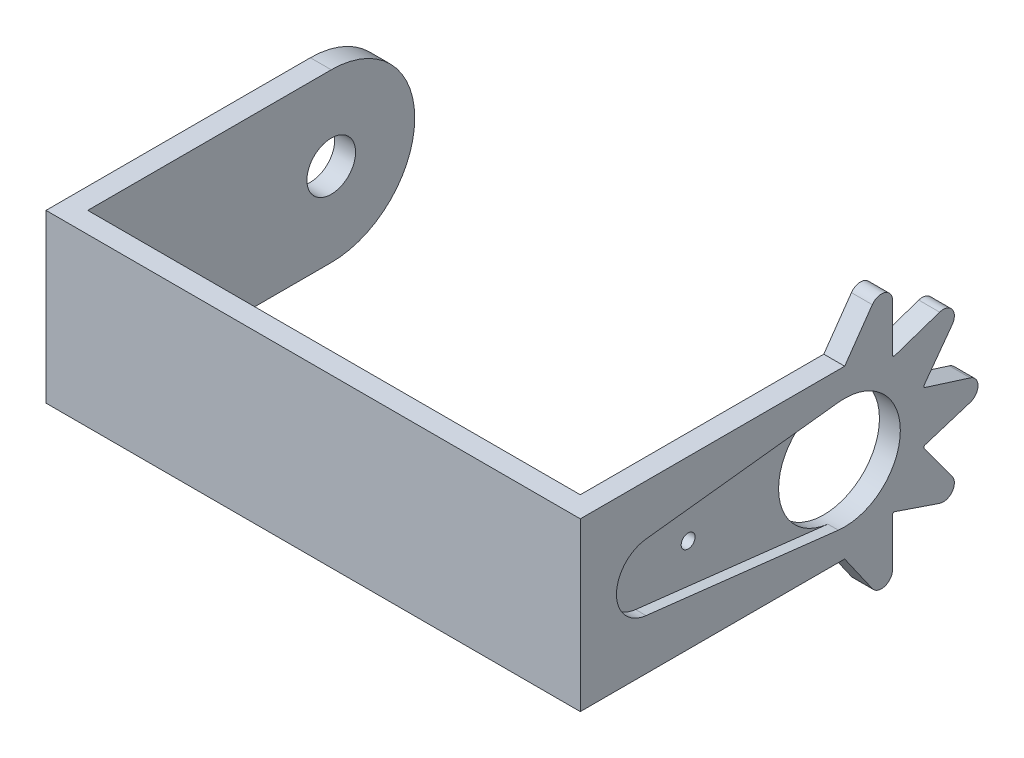
ISO-10303-21;
HEADER;
FILE_DESCRIPTION(('STEP AP214'),'2;1');
FILE_NAME('part.step','',(''),(''),'','','');
FILE_SCHEMA(('AUTOMOTIVE_DESIGN { 1 0 10303 214 1 1 1 1 }'));
ENDSEC;
DATA;
#1=APPLICATION_CONTEXT('core data for automotive mechanical design processes');
#2=APPLICATION_PROTOCOL_DEFINITION('international standard','automotive_design',2000,#1);
#3=PRODUCT_CONTEXT('',#1,'mechanical');
#4=PRODUCT('Part','Part','',(#3));
#5=PRODUCT_RELATED_PRODUCT_CATEGORY('part','',(#4));
#6=PRODUCT_DEFINITION_FORMATION('','',#4);
#7=PRODUCT_DEFINITION_CONTEXT('part definition',#1,'design');
#8=PRODUCT_DEFINITION('design','',#6,#7);
#9=PRODUCT_DEFINITION_SHAPE('','',#8);
#10=(LENGTH_UNIT() NAMED_UNIT(*) SI_UNIT(.MILLI.,.METRE.));
#11=(NAMED_UNIT(*) PLANE_ANGLE_UNIT() SI_UNIT($,.RADIAN.));
#12=(NAMED_UNIT(*) SI_UNIT($,.STERADIAN.) SOLID_ANGLE_UNIT());
#13=UNCERTAINTY_MEASURE_WITH_UNIT(LENGTH_MEASURE(1.E-05),#10,'distance_accuracy_value','');
#14=(GEOMETRIC_REPRESENTATION_CONTEXT(3) GLOBAL_UNCERTAINTY_ASSIGNED_CONTEXT((#13)) GLOBAL_UNIT_ASSIGNED_CONTEXT((#10,
#11,#12)) REPRESENTATION_CONTEXT('',''));
#15=CARTESIAN_POINT('',(0.,0.,0.));
#16=DIRECTION('',(0.,0.,1.));
#17=DIRECTION('',(1.,0.,0.));
#18=AXIS2_PLACEMENT_3D('',#15,#16,#17);
#19=CARTESIAN_POINT('',(38.4,6.,-19.));
#20=DIRECTION('',(-1.,0.,0.));
#21=DIRECTION('',(0.,0.,1.));
#22=AXIS2_PLACEMENT_3D('',#19,#20,#21);
#23=CYLINDRICAL_SURFACE('',#22,6.);
#24=DIRECTION('',(1.,0.,0.));
#25=VECTOR('',#24,1.);
#26=CARTESIAN_POINT('',(30.9560548347168,4.07136320818282,-24.6815807769712));
#27=LINE('',#26,#25);
#28=CARTESIAN_POINT('',(36.9,4.07136320818282,-24.6815807769712));
#29=VERTEX_POINT('',#28);
#30=CARTESIAN_POINT('',(38.4,4.07136320818282,-24.6815807769712));
#31=VERTEX_POINT('',#30);
#32=EDGE_CURVE('E472',#29,#31,#27,.T.);
#33=ORIENTED_EDGE('',*,*,#32,.F.);
#34=CARTESIAN_POINT('',(36.9,6.,-19.));
#35=DIRECTION('',(1.,0.,0.));
#36=DIRECTION('',(0.,0.,-1.));
#37=AXIS2_PLACEMENT_3D('',#34,#35,#36);
#38=CIRCLE('',#37,6.);
#39=CARTESIAN_POINT('',(36.9,4.1957652029756,-24.7223017044898));
#40=VERTEX_POINT('',#39);
#41=EDGE_CURVE('E316',#40,#29,#38,.F.);
#42=ORIENTED_EDGE('',*,*,#41,.F.);
#43=DIRECTION('',(1.,0.,0.));
#44=VECTOR('',#43,1.);
#45=CARTESIAN_POINT('',(30.9560548347168,4.1957652029756,-24.7223017044898));
#46=LINE('',#45,#44);
#47=CARTESIAN_POINT('',(38.4,4.1957652029756,-24.7223017044898));
#48=VERTEX_POINT('',#47);
#49=EDGE_CURVE('E58',#40,#48,#46,.T.);
#50=ORIENTED_EDGE('',*,*,#49,.T.);
#51=CARTESIAN_POINT('',(38.4,6.,-19.));
#52=DIRECTION('',(-1.,0.,0.));
#53=DIRECTION('',(0.,0.,1.));
#54=AXIS2_PLACEMENT_3D('',#51,#52,#53);
#55=CIRCLE('',#54,6.);
#56=EDGE_CURVE('E43',#31,#48,#55,.F.);
#57=ORIENTED_EDGE('',*,*,#56,.F.);
#58=EDGE_LOOP('',(#33,#42,#50,#57));
#59=FACE_BOUND('',#58,.T.);
#60=ADVANCED_FACE('F34',(#59),#23,.T.);
#61=CARTESIAN_POINT('',(0.,6.,-19.0000000000001));
#62=DIRECTION('',(1.,0.,0.));
#63=DIRECTION('',(0.,0.,-1.));
#64=AXIS2_PLACEMENT_3D('',#61,#62,#63);
#65=CYLINDRICAL_SURFACE('',#64,6.);
#66=DIRECTION('',(1.,0.,0.));
#67=VECTOR('',#66,1.);
#68=CARTESIAN_POINT('',(30.9560548347168,10.8386676256051,-22.5478578901812));
#69=LINE('',#68,#67);
#70=CARTESIAN_POINT('',(36.9,10.8386676256051,-22.5478578901812));
#71=VERTEX_POINT('',#70);
#72=CARTESIAN_POINT('',(38.4,10.8386676256051,-22.5478578901812));
#73=VERTEX_POINT('',#72);
#74=EDGE_CURVE('E512',#71,#73,#69,.T.);
#75=ORIENTED_EDGE('',*,*,#74,.F.);
#76=CARTESIAN_POINT('',(36.9,6.,-19.));
#77=DIRECTION('',(1.,0.,0.));
#78=DIRECTION('',(0.,0.,-1.));
#79=AXIS2_PLACEMENT_3D('',#76,#77,#78);
#80=CIRCLE('',#79,6.);
#81=CARTESIAN_POINT('',(36.9,10.914912265734,-22.4414586181063));
#82=VERTEX_POINT('',#81);
#83=EDGE_CURVE('E312',#82,#71,#80,.F.);
#84=ORIENTED_EDGE('',*,*,#83,.F.);
#85=DIRECTION('',(1.,0.,0.));
#86=VECTOR('',#85,1.);
#87=CARTESIAN_POINT('',(30.9560548347168,10.914912265734,-22.4414586181063));
#88=LINE('',#87,#86);
#89=CARTESIAN_POINT('',(38.4,10.914912265734,-22.4414586181063));
#90=VERTEX_POINT('',#89);
#91=EDGE_CURVE('E339',#82,#90,#88,.T.);
#92=ORIENTED_EDGE('',*,*,#91,.T.);
#93=CARTESIAN_POINT('',(38.4,6.,-19.));
#94=DIRECTION('',(-1.,0.,0.));
#95=DIRECTION('',(0.,0.,1.));
#96=AXIS2_PLACEMENT_3D('',#93,#94,#95);
#97=CIRCLE('',#96,6.);
#98=EDGE_CURVE('E319',#73,#90,#97,.F.);
#99=ORIENTED_EDGE('',*,*,#98,.F.);
#100=EDGE_LOOP('',(#75,#84,#92,#99));
#101=FACE_BOUND('',#100,.T.);
#102=ADVANCED_FACE('F348',(#101),#65,.T.);
#103=CARTESIAN_POINT('',(37.65,6.,-19.));
#104=DIRECTION('',(-1.,0.,0.));
#105=DIRECTION('',(0.,0.,1.));
#106=AXIS2_PLACEMENT_3D('',#103,#104,#105);
#107=PLANE('',#106);
#108=CARTESIAN_POINT('',(37.65,6.,-8.5));
#109=DIRECTION('',(1.,0.,0.));
#110=DIRECTION('',(0.,0.,-1.));
#111=AXIS2_PLACEMENT_3D('',#108,#109,#110);
#112=CIRCLE('',#111,0.500000000000001);
#113=CARTESIAN_POINT('',(37.65,6.,-9.));
#114=VERTEX_POINT('',#113);
#115=EDGE_CURVE('E359',#114,#114,#112,.T.);
#116=ORIENTED_EDGE('',*,*,#115,.F.);
#117=EDGE_LOOP('',(#116));
#118=FACE_BOUND('',#117,.T.);
#119=CARTESIAN_POINT('',(37.65,6.,-19.));
#120=DIRECTION('',(1.,0.,0.));
#121=DIRECTION('',(0.,0.,-1.));
#122=AXIS2_PLACEMENT_3D('',#119,#120,#121);
#123=CIRCLE('',#122,3.99999999999999);
#124=CARTESIAN_POINT('',(37.65,9.9737916915917,-18.5428571428571));
#125=VERTEX_POINT('',#124);
#126=CARTESIAN_POINT('',(37.65,2.0262083084083,-18.5428571428571));
#127=VERTEX_POINT('',#126);
#128=EDGE_CURVE('E372',#125,#127,#123,.T.);
#129=ORIENTED_EDGE('',*,*,#128,.F.);
#130=DIRECTION('',(0.,-0.114285714285714,0.993447922897926));
#131=VECTOR('',#130,1.);
#132=CARTESIAN_POINT('',(37.65,9.9737916915917,-18.5428571428571));
#133=LINE('',#132,#131);
#134=CARTESIAN_POINT('',(37.65,8.38427501495502,-4.72571428571429));
#135=VERTEX_POINT('',#134);
#136=EDGE_CURVE('E378',#125,#135,#133,.T.);
#137=ORIENTED_EDGE('',*,*,#136,.T.);
#138=CARTESIAN_POINT('',(37.65,6.,-5.));
#139=DIRECTION('',(1.,0.,0.));
#140=DIRECTION('',(0.,0.,-1.));
#141=AXIS2_PLACEMENT_3D('',#138,#139,#140);
#142=CIRCLE('',#141,2.4);
#143=CARTESIAN_POINT('',(37.65,3.61572498504498,-4.72571428571429));
#144=VERTEX_POINT('',#143);
#145=EDGE_CURVE('E381',#135,#144,#142,.T.);
#146=ORIENTED_EDGE('',*,*,#145,.T.);
#147=DIRECTION('',(0.,-0.114285714285714,-0.993447922897926));
#148=VECTOR('',#147,1.);
#149=CARTESIAN_POINT('',(37.65,3.61572498504498,-4.72571428571429));
#150=LINE('',#149,#148);
#151=EDGE_CURVE('E385',#144,#127,#150,.T.);
#152=ORIENTED_EDGE('',*,*,#151,.T.);
#153=EDGE_LOOP('',(#129,#137,#146,#152));
#154=FACE_BOUND('',#153,.T.);
#155=ADVANCED_FACE('F558',(#118,#154),#107,.F.);
#156=CARTESIAN_POINT('',(0.,12.,-25.));
#157=DIRECTION('',(1.,0.,0.));
#158=DIRECTION('',(0.,0.,-1.));
#159=AXIS2_PLACEMENT_3D('',#156,#157,#158);
#160=PLANE('',#159);
#161=CARTESIAN_POINT('',(0.,6.,-19.));
#162=DIRECTION('',(-1.,0.,0.));
#163=DIRECTION('',(0.,0.,1.));
#164=AXIS2_PLACEMENT_3D('',#161,#162,#163);
#165=CIRCLE('',#164,1.75);
#166=CARTESIAN_POINT('',(0.,6.,-17.25));
#167=VERTEX_POINT('',#166);
#168=EDGE_CURVE('E366',#167,#167,#165,.T.);
#169=ORIENTED_EDGE('',*,*,#168,.F.);
#170=EDGE_LOOP('',(#169));
#171=FACE_BOUND('',#170,.T.);
#172=CARTESIAN_POINT('',(0.,6.,-19.));
#173=DIRECTION('',(1.,0.,0.));
#174=DIRECTION('',(0.,0.,-1.));
#175=AXIS2_PLACEMENT_3D('',#172,#173,#174);
#176=CIRCLE('',#175,6.);
#177=CARTESIAN_POINT('',(0.,12.,-19.));
#178=VERTEX_POINT('',#177);
#179=CARTESIAN_POINT('',(0.,6.,-25.));
#180=VERTEX_POINT('',#179);
#181=EDGE_CURVE('E297',#178,#180,#176,.F.);
#182=ORIENTED_EDGE('',*,*,#181,.T.);
#183=CARTESIAN_POINT('',(0.,6.,-19.));
#184=DIRECTION('',(1.,0.,0.));
#185=DIRECTION('',(0.,0.,-1.));
#186=AXIS2_PLACEMENT_3D('',#183,#184,#185);
#187=CIRCLE('',#186,6.);
#188=CARTESIAN_POINT('',(0.,0.,-19.));
#189=VERTEX_POINT('',#188);
#190=EDGE_CURVE('E264',#180,#189,#187,.F.);
#191=ORIENTED_EDGE('',*,*,#190,.T.);
#192=DIRECTION('',(0.,0.,1.));
#193=VECTOR('',#192,1.);
#194=CARTESIAN_POINT('',(0.,0.,-25.));
#195=LINE('',#194,#193);
#196=CARTESIAN_POINT('',(0.,0.,0.));
#197=VERTEX_POINT('',#196);
#198=EDGE_CURVE('E277',#189,#197,#195,.T.);
#199=ORIENTED_EDGE('',*,*,#198,.T.);
#200=DIRECTION('',(0.,-1.,0.));
#201=VECTOR('',#200,1.);
#202=CARTESIAN_POINT('',(0.,12.,0.));
#203=LINE('',#202,#201);
#204=CARTESIAN_POINT('',(0.,12.,0.));
#205=VERTEX_POINT('',#204);
#206=EDGE_CURVE('E294',#205,#197,#203,.T.);
#207=ORIENTED_EDGE('',*,*,#206,.F.);
#208=DIRECTION('',(0.,0.,1.));
#209=VECTOR('',#208,1.);
#210=CARTESIAN_POINT('',(0.,12.,-25.));
#211=LINE('',#210,#209);
#212=EDGE_CURVE('E285',#178,#205,#211,.T.);
#213=ORIENTED_EDGE('',*,*,#212,.F.);
#214=EDGE_LOOP('',(#182,#191,#199,#207,#213));
#215=FACE_BOUND('',#214,.T.);
#216=ADVANCED_FACE('F446',(#171,#215),#160,.F.);
#217=CARTESIAN_POINT('',(0.,12.,0.));
#218=DIRECTION('',(0.,0.,-1.));
#219=DIRECTION('',(-1.,0.,0.));
#220=AXIS2_PLACEMENT_3D('',#217,#218,#219);
#221=PLANE('',#220);
#222=DIRECTION('',(1.,0.,0.));
#223=VECTOR('',#222,1.);
#224=CARTESIAN_POINT('',(0.,0.,0.));
#225=LINE('',#224,#223);
#226=CARTESIAN_POINT('',(38.4,0.,0.));
#227=VERTEX_POINT('',#226);
#228=EDGE_CURVE('E273',#197,#227,#225,.T.);
#229=ORIENTED_EDGE('',*,*,#228,.T.);
#230=DIRECTION('',(0.,-1.,0.));
#231=VECTOR('',#230,1.);
#232=CARTESIAN_POINT('',(38.4,12.,0.));
#233=LINE('',#232,#231);
#234=CARTESIAN_POINT('',(38.4,12.,0.));
#235=VERTEX_POINT('',#234);
#236=EDGE_CURVE('E272',#235,#227,#233,.T.);
#237=ORIENTED_EDGE('',*,*,#236,.F.);
#238=DIRECTION('',(1.,0.,0.));
#239=VECTOR('',#238,1.);
#240=CARTESIAN_POINT('',(0.,12.,0.));
#241=LINE('',#240,#239);
#242=EDGE_CURVE('E407',#205,#235,#241,.T.);
#243=ORIENTED_EDGE('',*,*,#242,.F.);
#244=ORIENTED_EDGE('',*,*,#206,.T.);
#245=EDGE_LOOP('',(#229,#237,#243,#244));
#246=FACE_BOUND('',#245,.T.);
#247=ADVANCED_FACE('F445',(#246),#221,.F.);
#248=CARTESIAN_POINT('',(38.4,12.,0.));
#249=DIRECTION('',(-1.,0.,0.));
#250=DIRECTION('',(0.,0.,1.));
#251=AXIS2_PLACEMENT_3D('',#248,#249,#250);
#252=PLANE('',#251);
#253=DIRECTION('',(0.,0.300705799504067,0.953716950748292));
#254=VECTOR('',#253,1.);
#255=CARTESIAN_POINT('',(38.4,7.80423479702684,-24.722301704489));
#256=LINE('',#255,#254);
#257=CARTESIAN_POINT('',(38.4,6.76297356060051,-28.0247604298435));
#258=VERTEX_POINT('',#257);
#259=CARTESIAN_POINT('',(38.4,7.80423479702684,-24.722301704489));
#260=VERTEX_POINT('',#259);
#261=EDGE_CURVE('E499',#258,#260,#256,.T.);
#262=ORIENTED_EDGE('',*,*,#261,.T.);
#263=CARTESIAN_POINT('',(38.4,7.92863679181937,-24.6815807769705));
#264=VERTEX_POINT('',#263);
#265=EDGE_CURVE('E320',#260,#264,#97,.F.);
#266=ORIENTED_EDGE('',*,*,#265,.T.);
#267=DIRECTION('',(0.,0.806444604267543,-0.5913096483635));
#268=VECTOR('',#267,1.);
#269=CARTESIAN_POINT('',(38.4,10.7211320051936,-26.729122981282));
#270=LINE('',#269,#268);
#271=CARTESIAN_POINT('',(38.4,10.7211320051936,-26.729122981282));
#272=VERTEX_POINT('',#271);
#273=EDGE_CURVE('E508',#264,#272,#270,.T.);
#274=ORIENTED_EDGE('',*,*,#273,.T.);
#275=CARTESIAN_POINT('',(38.4,11.1941797238844,-26.083967297868));
#276=DIRECTION('',(1.,0.,0.));
#277=DIRECTION('',(0.,0.,-1.));
#278=AXIS2_PLACEMENT_3D('',#275,#276,#277);
#279=CIRCLE('',#278,0.800000000000002);
#280=CARTESIAN_POINT('',(38.4,11.9517238274805,-25.8268157256254));
#281=VERTEX_POINT('',#280);
#282=EDGE_CURVE('E515',#272,#281,#279,.T.);
#283=ORIENTED_EDGE('',*,*,#282,.T.);
#284=DIRECTION('',(0.,-0.321439465303267,0.94693012949507));
#285=VECTOR('',#284,1.);
#286=CARTESIAN_POINT('',(38.4,10.8386676256051,-22.5478578901812));
#287=LINE('',#286,#285);
#288=EDGE_CURVE('E332',#281,#73,#287,.T.);
#289=ORIENTED_EDGE('',*,*,#288,.T.);
#290=ORIENTED_EDGE('',*,*,#98,.T.);
#291=DIRECTION('',(0.,1.,0.));
#292=VECTOR('',#291,1.);
#293=CARTESIAN_POINT('',(38.4,14.3776364238434,-22.4414586181063));
#294=LINE('',#293,#292);
#295=CARTESIAN_POINT('',(38.4,14.3776364238434,-22.4414586181063));
#296=VERTEX_POINT('',#295);
#297=EDGE_CURVE('E329',#90,#296,#294,.T.);
#298=ORIENTED_EDGE('',*,*,#297,.T.);
#299=CARTESIAN_POINT('',(38.4,14.3776364238434,-21.6414586181063));
#300=DIRECTION('',(1.,0.,0.));
#301=DIRECTION('',(0.,0.,-1.));
#302=AXIS2_PLACEMENT_3D('',#299,#300,#301);
#303=CIRCLE('',#302,0.800000000000002);
#304=CARTESIAN_POINT('',(38.4,14.8364975729242,-20.9861369826751));
#305=VERTEX_POINT('',#304);
#306=EDGE_CURVE('E344',#296,#305,#303,.T.);
#307=ORIENTED_EDGE('',*,*,#306,.T.);
#308=DIRECTION('',(0.,-0.819152044288995,0.573576436351041));
#309=VECTOR('',#308,1.);
#310=CARTESIAN_POINT('',(38.4,12.,-19.));
#311=LINE('',#310,#309);
#312=CARTESIAN_POINT('',(38.4,12.,-19.));
#313=VERTEX_POINT('',#312);
#314=EDGE_CURVE('E349',#305,#313,#311,.T.);
#315=ORIENTED_EDGE('',*,*,#314,.T.);
#316=DIRECTION('',(0.,0.,-1.));
#317=VECTOR('',#316,1.);
#318=CARTESIAN_POINT('',(38.4,12.,0.));
#319=LINE('',#318,#317);
#320=EDGE_CURVE('E409',#235,#313,#319,.T.);
#321=ORIENTED_EDGE('',*,*,#320,.F.);
#322=ORIENTED_EDGE('',*,*,#236,.T.);
#323=DIRECTION('',(0.,0.,-1.));
#324=VECTOR('',#323,1.);
#325=CARTESIAN_POINT('',(38.4,0.,0.));
#326=LINE('',#325,#324);
#327=CARTESIAN_POINT('',(38.4,0.,-19.0000000000026));
#328=VERTEX_POINT('',#327);
#329=EDGE_CURVE('E260',#227,#328,#326,.T.);
#330=ORIENTED_EDGE('',*,*,#329,.T.);
#331=DIRECTION('',(0.,-0.819152044288751,-0.573576436351389));
#332=VECTOR('',#331,1.);
#333=CARTESIAN_POINT('',(38.4,-2.83649757292336,-20.9861369826788));
#334=LINE('',#333,#332);
#335=CARTESIAN_POINT('',(38.4,-2.83649757292336,-20.9861369826788));
#336=VERTEX_POINT('',#335);
#337=EDGE_CURVE('E240',#328,#336,#334,.T.);
#338=ORIENTED_EDGE('',*,*,#337,.T.);
#339=CARTESIAN_POINT('',(38.4,-2.37763642384225,-21.6414586181098));
#340=DIRECTION('',(1.,0.,0.));
#341=DIRECTION('',(0.,0.,-1.));
#342=AXIS2_PLACEMENT_3D('',#339,#340,#341);
#343=CIRCLE('',#342,0.8);
#344=CARTESIAN_POINT('',(38.4,-2.3776364238419,-22.4414586181098));
#345=VERTEX_POINT('',#344);
#346=EDGE_CURVE('E252',#336,#345,#343,.T.);
#347=ORIENTED_EDGE('',*,*,#346,.T.);
#348=DIRECTION('',(0.,1.,4.25825127054114E-13));
#349=VECTOR('',#348,1.);
#350=CARTESIAN_POINT('',(38.4,1.0850877342675,-22.4414586181083));
#351=LINE('',#350,#349);
#352=CARTESIAN_POINT('',(38.4,1.0850877342675,-22.4414586181083));
#353=VERTEX_POINT('',#352);
#354=EDGE_CURVE('E590',#345,#353,#351,.T.);
#355=ORIENTED_EDGE('',*,*,#354,.T.);
#356=CARTESIAN_POINT('',(38.4,1.16133237439624,-22.5478578901831));
#357=VERTEX_POINT('',#356);
#358=EDGE_CURVE('E11',#353,#357,#55,.F.);
#359=ORIENTED_EDGE('',*,*,#358,.T.);
#360=DIRECTION('',(0.,-0.321439465302864,-0.946930129495207));
#361=VECTOR('',#360,1.);
#362=CARTESIAN_POINT('',(38.4,0.0482761725222498,-25.8268157256278));
#363=LINE('',#362,#361);
#364=CARTESIAN_POINT('',(38.4,0.0482761725222558,-25.8268157256278));
#365=VERTEX_POINT('',#364);
#366=EDGE_CURVE('E459',#357,#365,#363,.T.);
#367=ORIENTED_EDGE('',*,*,#366,.T.);
#368=CARTESIAN_POINT('',(38.4,0.805820276118422,-26.0839672978701));
#369=DIRECTION('',(1.,0.,0.));
#370=DIRECTION('',(0.,0.,-1.));
#371=AXIS2_PLACEMENT_3D('',#368,#369,#370);
#372=CIRCLE('',#371,0.800000000000001);
#373=CARTESIAN_POINT('',(38.4,1.27886799480949,-26.7291229812839));
#374=VERTEX_POINT('',#373);
#375=EDGE_CURVE('E463',#365,#374,#372,.T.);
#376=ORIENTED_EDGE('',*,*,#375,.T.);
#377=DIRECTION('',(0.,0.806444604267292,0.591309648363842));
#378=VECTOR('',#377,1.);
#379=CARTESIAN_POINT('',(38.4,4.07136320818282,-24.6815807769712));
#380=LINE('',#379,#378);
#381=EDGE_CURVE('E477',#374,#31,#380,.T.);
#382=ORIENTED_EDGE('',*,*,#381,.T.);
#383=ORIENTED_EDGE('',*,*,#56,.T.);
#384=DIRECTION('',(0.,0.300705799504473,-0.953716950748164));
#385=VECTOR('',#384,1.);
#386=CARTESIAN_POINT('',(38.4,5.23702643940334,-28.0247604298439));
#387=LINE('',#386,#385);
#388=CARTESIAN_POINT('',(38.4,5.23702643940334,-28.0247604298439));
#389=VERTEX_POINT('',#388);
#390=EDGE_CURVE('E487',#48,#389,#387,.T.);
#391=ORIENTED_EDGE('',*,*,#390,.T.);
#392=CARTESIAN_POINT('',(38.4,6.00000000000187,-27.7841957902403));
#393=DIRECTION('',(1.,0.,0.));
#394=DIRECTION('',(0.,0.,-1.));
#395=AXIS2_PLACEMENT_3D('',#392,#393,#394);
#396=CIRCLE('',#395,0.800000000000003);
#397=EDGE_CURVE('E496',#389,#258,#396,.T.);
#398=ORIENTED_EDGE('',*,*,#397,.T.);
#399=EDGE_LOOP('',(#262,#266,#274,#283,#289,#290,#298,#307,#315,#321,#322,#330,#338,#347,#355,
#359,#367,#376,#382,#383,#391,#398));
#400=FACE_BOUND('',#399,.T.);
#401=DIRECTION('',(0.,-0.114285714285714,0.993447922897926));
#402=VECTOR('',#401,1.);
#403=CARTESIAN_POINT('',(38.4,9.9737916915917,-18.5428571428571));
#404=LINE('',#403,#402);
#405=CARTESIAN_POINT('',(38.4,9.9737916915917,-18.5428571428571));
#406=VERTEX_POINT('',#405);
#407=CARTESIAN_POINT('',(38.4,8.38427501495502,-4.72571428571429));
#408=VERTEX_POINT('',#407);
#409=EDGE_CURVE('E390',#406,#408,#404,.T.);
#410=ORIENTED_EDGE('',*,*,#409,.F.);
#411=CARTESIAN_POINT('',(38.4,6.,-19.));
#412=DIRECTION('',(1.,0.,0.));
#413=DIRECTION('',(0.,0.,1.));
#414=AXIS2_PLACEMENT_3D('',#411,#412,#413);
#415=CIRCLE('',#414,4.);
#416=CARTESIAN_POINT('',(38.4,2.0262083084083,-18.5428571428571));
#417=VERTEX_POINT('',#416);
#418=EDGE_CURVE('E377',#417,#406,#415,.T.);
#419=ORIENTED_EDGE('',*,*,#418,.F.);
#420=DIRECTION('',(0.,-0.114285714285714,-0.993447922897926));
#421=VECTOR('',#420,1.);
#422=CARTESIAN_POINT('',(38.4,3.61572498504498,-4.72571428571429));
#423=LINE('',#422,#421);
#424=CARTESIAN_POINT('',(38.4,3.61572498504498,-4.72571428571429));
#425=VERTEX_POINT('',#424);
#426=EDGE_CURVE('E382',#425,#417,#423,.T.);
#427=ORIENTED_EDGE('',*,*,#426,.F.);
#428=CARTESIAN_POINT('',(38.4,6.,-5.));
#429=DIRECTION('',(1.,0.,0.));
#430=DIRECTION('',(0.,0.,-1.));
#431=AXIS2_PLACEMENT_3D('',#428,#429,#430);
#432=CIRCLE('',#431,2.4);
#433=EDGE_CURVE('E393',#408,#425,#432,.T.);
#434=ORIENTED_EDGE('',*,*,#433,.F.);
#435=EDGE_LOOP('',(#410,#419,#427,#434));
#436=FACE_BOUND('',#435,.T.);
#437=ADVANCED_FACE('F268',(#400,#436),#252,.F.);
#438=CARTESIAN_POINT('',(36.9,12.,-25.));
#439=DIRECTION('',(1.,0.,0.));
#440=DIRECTION('',(0.,0.,-1.));
#441=AXIS2_PLACEMENT_3D('',#438,#439,#440);
#442=PLANE('',#441);
#443=CARTESIAN_POINT('',(36.9,7.92863679181938,-24.6815807769705));
#444=VERTEX_POINT('',#443);
#445=CARTESIAN_POINT('',(36.9,7.80423479702684,-24.722301704489));
#446=VERTEX_POINT('',#445);
#447=EDGE_CURVE('E311',#444,#446,#80,.F.);
#448=ORIENTED_EDGE('',*,*,#447,.T.);
#449=DIRECTION('',(0.,-0.300705799504067,-0.953716950748292));
#450=VECTOR('',#449,1.);
#451=CARTESIAN_POINT('',(36.9,7.80423479702684,-24.722301704489));
#452=LINE('',#451,#450);
#453=CARTESIAN_POINT('',(36.9,6.76297356060051,-28.0247604298435));
#454=VERTEX_POINT('',#453);
#455=EDGE_CURVE('E490',#446,#454,#452,.T.);
#456=ORIENTED_EDGE('',*,*,#455,.T.);
#457=CARTESIAN_POINT('',(36.9,6.00000000000187,-27.7841957902403));
#458=DIRECTION('',(1.,0.,0.));
#459=DIRECTION('',(0.,0.,-1.));
#460=AXIS2_PLACEMENT_3D('',#457,#458,#459);
#461=CIRCLE('',#460,0.800000000000003);
#462=CARTESIAN_POINT('',(36.9,5.23702643940334,-28.0247604298439));
#463=VERTEX_POINT('',#462);
#464=EDGE_CURVE('E488',#454,#463,#461,.F.);
#465=ORIENTED_EDGE('',*,*,#464,.T.);
#466=DIRECTION('',(0.,-0.300705799504473,0.953716950748164));
#467=VECTOR('',#466,1.);
#468=CARTESIAN_POINT('',(36.9,5.23702643940334,-28.0247604298439));
#469=LINE('',#468,#467);
#470=EDGE_CURVE('E493',#463,#40,#469,.T.);
#471=ORIENTED_EDGE('',*,*,#470,.T.);
#472=ORIENTED_EDGE('',*,*,#41,.T.);
#473=DIRECTION('',(0.,-0.806444604267292,-0.591309648363842));
#474=VECTOR('',#473,1.);
#475=CARTESIAN_POINT('',(36.9,4.07136320818282,-24.6815807769712));
#476=LINE('',#475,#474);
#477=CARTESIAN_POINT('',(36.9,1.2788679948095,-26.7291229812839));
#478=VERTEX_POINT('',#477);
#479=EDGE_CURVE('E471',#29,#478,#476,.T.);
#480=ORIENTED_EDGE('',*,*,#479,.T.);
#481=CARTESIAN_POINT('',(36.9,0.805820276118422,-26.0839672978701));
#482=DIRECTION('',(1.,0.,0.));
#483=DIRECTION('',(0.,0.,-1.));
#484=AXIS2_PLACEMENT_3D('',#481,#482,#483);
#485=CIRCLE('',#484,0.800000000000001);
#486=CARTESIAN_POINT('',(36.9,0.0482761725222558,-25.8268157256278));
#487=VERTEX_POINT('',#486);
#488=EDGE_CURVE('E469',#478,#487,#485,.F.);
#489=ORIENTED_EDGE('',*,*,#488,.T.);
#490=DIRECTION('',(0.,0.321439465302864,0.946930129495207));
#491=VECTOR('',#490,1.);
#492=CARTESIAN_POINT('',(36.9,0.0482761725222498,-25.8268157256278));
#493=LINE('',#492,#491);
#494=CARTESIAN_POINT('',(36.9,1.16133237439624,-22.5478578901831));
#495=VERTEX_POINT('',#494);
#496=EDGE_CURVE('E473',#487,#495,#493,.T.);
#497=ORIENTED_EDGE('',*,*,#496,.T.);
#498=CARTESIAN_POINT('',(36.9,1.0850877342675,-22.4414586181083));
#499=VERTEX_POINT('',#498);
#500=EDGE_CURVE('E315',#495,#499,#38,.F.);
#501=ORIENTED_EDGE('',*,*,#500,.T.);
#502=DIRECTION('',(0.,-1.,-4.25825127054114E-13));
#503=VECTOR('',#502,1.);
#504=CARTESIAN_POINT('',(36.9,1.0850877342675,-22.4414586181083));
#505=LINE('',#504,#503);
#506=CARTESIAN_POINT('',(36.9,-2.37763642384225,-22.4414586181098));
#507=VERTEX_POINT('',#506);
#508=EDGE_CURVE('E460',#499,#507,#505,.T.);
#509=ORIENTED_EDGE('',*,*,#508,.T.);
#510=CARTESIAN_POINT('',(36.9,-2.37763642384225,-21.6414586181098));
#511=DIRECTION('',(1.,0.,0.));
#512=DIRECTION('',(0.,0.,-1.));
#513=AXIS2_PLACEMENT_3D('',#510,#511,#512);
#514=CIRCLE('',#513,0.8);
#515=CARTESIAN_POINT('',(36.9,-2.83649757292336,-20.9861369826788));
#516=VERTEX_POINT('',#515);
#517=EDGE_CURVE('E458',#507,#516,#514,.F.);
#518=ORIENTED_EDGE('',*,*,#517,.T.);
#519=DIRECTION('',(0.,0.819152044288751,0.573576436351389));
#520=VECTOR('',#519,1.);
#521=CARTESIAN_POINT('',(36.9,-2.83649757292336,-20.9861369826788));
#522=LINE('',#521,#520);
#523=CARTESIAN_POINT('',(36.9,0.,-19.));
#524=VERTEX_POINT('',#523);
#525=EDGE_CURVE('E456',#516,#524,#522,.T.);
#526=ORIENTED_EDGE('',*,*,#525,.T.);
#527=DIRECTION('',(0.,0.,1.));
#528=VECTOR('',#527,1.);
#529=CARTESIAN_POINT('',(36.9,0.,-25.));
#530=LINE('',#529,#528);
#531=CARTESIAN_POINT('',(36.9,0.,-1.5));
#532=VERTEX_POINT('',#531);
#533=EDGE_CURVE('E262',#524,#532,#530,.T.);
#534=ORIENTED_EDGE('',*,*,#533,.T.);
#535=DIRECTION('',(0.,-1.,0.));
#536=VECTOR('',#535,1.);
#537=CARTESIAN_POINT('',(36.9,12.,-1.5));
#538=LINE('',#537,#536);
#539=CARTESIAN_POINT('',(36.9,12.,-1.5));
#540=VERTEX_POINT('',#539);
#541=EDGE_CURVE('E289',#540,#532,#538,.T.);
#542=ORIENTED_EDGE('',*,*,#541,.F.);
#543=DIRECTION('',(0.,0.,1.));
#544=VECTOR('',#543,1.);
#545=CARTESIAN_POINT('',(36.9,12.,-25.));
#546=LINE('',#545,#544);
#547=CARTESIAN_POINT('',(36.9,12.,-19.));
#548=VERTEX_POINT('',#547);
#549=EDGE_CURVE('E412',#548,#540,#546,.T.);
#550=ORIENTED_EDGE('',*,*,#549,.F.);
#551=DIRECTION('',(0.,0.819152044288996,-0.573576436351041));
#552=VECTOR('',#551,1.);
#553=CARTESIAN_POINT('',(36.9,12.,-19.));
#554=LINE('',#553,#552);
#555=CARTESIAN_POINT('',(36.9,14.8364975729242,-20.9861369826751));
#556=VERTEX_POINT('',#555);
#557=EDGE_CURVE('E360',#548,#556,#554,.T.);
#558=ORIENTED_EDGE('',*,*,#557,.T.);
#559=CARTESIAN_POINT('',(36.9,14.3776364238434,-21.6414586181063));
#560=DIRECTION('',(1.,0.,0.));
#561=DIRECTION('',(0.,0.,-1.));
#562=AXIS2_PLACEMENT_3D('',#559,#560,#561);
#563=CIRCLE('',#562,0.800000000000002);
#564=CARTESIAN_POINT('',(36.9,14.3776364238434,-22.4414586181063));
#565=VERTEX_POINT('',#564);
#566=EDGE_CURVE('E528',#556,#565,#563,.F.);
#567=ORIENTED_EDGE('',*,*,#566,.T.);
#568=DIRECTION('',(0.,-1.,0.));
#569=VECTOR('',#568,1.);
#570=CARTESIAN_POINT('',(36.9,14.3776364238434,-22.4414586181063));
#571=LINE('',#570,#569);
#572=EDGE_CURVE('E357',#565,#82,#571,.T.);
#573=ORIENTED_EDGE('',*,*,#572,.T.);
#574=ORIENTED_EDGE('',*,*,#83,.T.);
#575=DIRECTION('',(0.,0.321439465303267,-0.94693012949507));
#576=VECTOR('',#575,1.);
#577=CARTESIAN_POINT('',(36.9,10.8386676256051,-22.5478578901812));
#578=LINE('',#577,#576);
#579=CARTESIAN_POINT('',(36.9,11.9517238274805,-25.8268157256254));
#580=VERTEX_POINT('',#579);
#581=EDGE_CURVE('E511',#71,#580,#578,.T.);
#582=ORIENTED_EDGE('',*,*,#581,.T.);
#583=CARTESIAN_POINT('',(36.9,11.1941797238844,-26.083967297868));
#584=DIRECTION('',(1.,0.,0.));
#585=DIRECTION('',(0.,0.,-1.));
#586=AXIS2_PLACEMENT_3D('',#583,#584,#585);
#587=CIRCLE('',#586,0.800000000000002);
#588=CARTESIAN_POINT('',(36.9,10.7211320051936,-26.729122981282));
#589=VERTEX_POINT('',#588);
#590=EDGE_CURVE('E509',#580,#589,#587,.F.);
#591=ORIENTED_EDGE('',*,*,#590,.T.);
#592=DIRECTION('',(0.,-0.806444604267543,0.5913096483635));
#593=VECTOR('',#592,1.);
#594=CARTESIAN_POINT('',(36.9,10.7211320051936,-26.729122981282));
#595=LINE('',#594,#593);
#596=EDGE_CURVE('E345',#589,#444,#595,.T.);
#597=ORIENTED_EDGE('',*,*,#596,.T.);
#598=EDGE_LOOP('',(#448,#456,#465,#471,#472,#480,#489,#497,#501,#509,#518,#526,#534,#542,#550,
#558,#567,#573,#574,#582,#591,#597));
#599=FACE_BOUND('',#598,.T.);
#600=CARTESIAN_POINT('',(36.9,6.,-8.5));
#601=DIRECTION('',(1.,0.,0.));
#602=DIRECTION('',(0.,0.,-1.));
#603=AXIS2_PLACEMENT_3D('',#600,#601,#602);
#604=CIRCLE('',#603,0.500000000000001);
#605=CARTESIAN_POINT('',(36.9,6.,-9.));
#606=VERTEX_POINT('',#605);
#607=EDGE_CURVE('E363',#606,#606,#604,.F.);
#608=ORIENTED_EDGE('',*,*,#607,.F.);
#609=EDGE_LOOP('',(#608));
#610=FACE_BOUND('',#609,.T.);
#611=CARTESIAN_POINT('',(36.9,6.,-19.));
#612=DIRECTION('',(1.,0.,0.));
#613=DIRECTION('',(0.,0.,-1.));
#614=AXIS2_PLACEMENT_3D('',#611,#612,#613);
#615=CIRCLE('',#614,3.99999999999999);
#616=CARTESIAN_POINT('',(36.9,6.,-23.));
#617=VERTEX_POINT('',#616);
#618=EDGE_CURVE('E374',#617,#617,#615,.F.);
#619=ORIENTED_EDGE('',*,*,#618,.F.);
#620=EDGE_LOOP('',(#619));
#621=FACE_BOUND('',#620,.T.);
#622=ADVANCED_FACE('F453',(#599,#610,#621),#442,.F.);
#623=CARTESIAN_POINT('',(36.9,12.,-1.5));
#624=DIRECTION('',(0.,0.,1.));
#625=DIRECTION('',(1.,0.,0.));
#626=AXIS2_PLACEMENT_3D('',#623,#624,#625);
#627=PLANE('',#626);
#628=DIRECTION('',(-1.,0.,0.));
#629=VECTOR('',#628,1.);
#630=CARTESIAN_POINT('',(36.9,0.,-1.5));
#631=LINE('',#630,#629);
#632=CARTESIAN_POINT('',(1.5,0.,-1.5));
#633=VERTEX_POINT('',#632);
#634=EDGE_CURVE('E275',#532,#633,#631,.T.);
#635=ORIENTED_EDGE('',*,*,#634,.T.);
#636=DIRECTION('',(0.,-1.,0.));
#637=VECTOR('',#636,1.);
#638=CARTESIAN_POINT('',(1.5,12.,-1.5));
#639=LINE('',#638,#637);
#640=CARTESIAN_POINT('',(1.5,12.,-1.5));
#641=VERTEX_POINT('',#640);
#642=EDGE_CURVE('E286',#641,#633,#639,.T.);
#643=ORIENTED_EDGE('',*,*,#642,.F.);
#644=DIRECTION('',(-1.,0.,0.));
#645=VECTOR('',#644,1.);
#646=CARTESIAN_POINT('',(36.9,12.,-1.5));
#647=LINE('',#646,#645);
#648=EDGE_CURVE('E414',#540,#641,#647,.T.);
#649=ORIENTED_EDGE('',*,*,#648,.F.);
#650=ORIENTED_EDGE('',*,*,#541,.T.);
#651=EDGE_LOOP('',(#635,#643,#649,#650));
#652=FACE_BOUND('',#651,.T.);
#653=ADVANCED_FACE('F441',(#652),#627,.F.);
#654=CARTESIAN_POINT('',(1.5,12.,-1.5));
#655=DIRECTION('',(-1.,0.,0.));
#656=DIRECTION('',(0.,0.,1.));
#657=AXIS2_PLACEMENT_3D('',#654,#655,#656);
#658=PLANE('',#657);
#659=CARTESIAN_POINT('',(1.5,6.,-19.));
#660=DIRECTION('',(-1.,0.,0.));
#661=DIRECTION('',(0.,0.,1.));
#662=AXIS2_PLACEMENT_3D('',#659,#660,#661);
#663=CIRCLE('',#662,1.75);
#664=CARTESIAN_POINT('',(1.5,6.,-17.25));
#665=VERTEX_POINT('',#664);
#666=EDGE_CURVE('E369',#665,#665,#663,.F.);
#667=ORIENTED_EDGE('',*,*,#666,.F.);
#668=EDGE_LOOP('',(#667));
#669=FACE_BOUND('',#668,.T.);
#670=DIRECTION('',(0.,0.,-1.));
#671=VECTOR('',#670,1.);
#672=CARTESIAN_POINT('',(1.5,0.,-1.5));
#673=LINE('',#672,#671);
#674=CARTESIAN_POINT('',(1.5,0.,-19.));
#675=VERTEX_POINT('',#674);
#676=EDGE_CURVE('E282',#633,#675,#673,.T.);
#677=ORIENTED_EDGE('',*,*,#676,.T.);
#678=CARTESIAN_POINT('',(1.5,6.,-19.));
#679=DIRECTION('',(-1.,0.,0.));
#680=DIRECTION('',(0.,0.,1.));
#681=AXIS2_PLACEMENT_3D('',#678,#679,#680);
#682=CIRCLE('',#681,6.);
#683=CARTESIAN_POINT('',(1.5,6.,-25.));
#684=VERTEX_POINT('',#683);
#685=EDGE_CURVE('E304',#675,#684,#682,.F.);
#686=ORIENTED_EDGE('',*,*,#685,.T.);
#687=CARTESIAN_POINT('',(1.5,6.,-19.));
#688=DIRECTION('',(-1.,0.,0.));
#689=DIRECTION('',(0.,0.,1.));
#690=AXIS2_PLACEMENT_3D('',#687,#688,#689);
#691=CIRCLE('',#690,6.);
#692=CARTESIAN_POINT('',(1.5,12.,-19.));
#693=VERTEX_POINT('',#692);
#694=EDGE_CURVE('E302',#684,#693,#691,.F.);
#695=ORIENTED_EDGE('',*,*,#694,.T.);
#696=DIRECTION('',(0.,0.,-1.));
#697=VECTOR('',#696,1.);
#698=CARTESIAN_POINT('',(1.5,12.,-1.5));
#699=LINE('',#698,#697);
#700=EDGE_CURVE('E290',#641,#693,#699,.T.);
#701=ORIENTED_EDGE('',*,*,#700,.F.);
#702=ORIENTED_EDGE('',*,*,#642,.T.);
#703=EDGE_LOOP('',(#677,#686,#695,#701,#702));
#704=FACE_BOUND('',#703,.T.);
#705=ADVANCED_FACE('F432',(#669,#704),#658,.F.);
#706=CARTESIAN_POINT('',(0.,12.,0.));
#707=DIRECTION('',(0.,1.,0.));
#708=DIRECTION('',(0.,0.,1.));
#709=AXIS2_PLACEMENT_3D('',#706,#707,#708);
#710=PLANE('',#709);
#711=ORIENTED_EDGE('',*,*,#700,.T.);
#712=DIRECTION('',(-1.,0.,0.));
#713=VECTOR('',#712,1.);
#714=CARTESIAN_POINT('',(0.,12.,-19.));
#715=LINE('',#714,#713);
#716=EDGE_CURVE('E309',#693,#178,#715,.T.);
#717=ORIENTED_EDGE('',*,*,#716,.T.);
#718=ORIENTED_EDGE('',*,*,#212,.T.);
#719=ORIENTED_EDGE('',*,*,#242,.T.);
#720=ORIENTED_EDGE('',*,*,#320,.T.);
#721=DIRECTION('',(-1.,0.,0.));
#722=VECTOR('',#721,1.);
#723=CARTESIAN_POINT('',(36.9,12.,-19.));
#724=LINE('',#723,#722);
#725=EDGE_CURVE('E306',#313,#548,#724,.T.);
#726=ORIENTED_EDGE('',*,*,#725,.T.);
#727=ORIENTED_EDGE('',*,*,#549,.T.);
#728=ORIENTED_EDGE('',*,*,#648,.T.);
#729=EDGE_LOOP('',(#711,#717,#718,#719,#720,#726,#727,#728));
#730=FACE_BOUND('',#729,.T.);
#731=ADVANCED_FACE('F434',(#730),#710,.T.);
#732=CARTESIAN_POINT('',(0.,0.,0.));
#733=DIRECTION('',(0.,1.,0.));
#734=DIRECTION('',(0.,0.,1.));
#735=AXIS2_PLACEMENT_3D('',#732,#733,#734);
#736=PLANE('',#735);
#737=ORIENTED_EDGE('',*,*,#198,.F.);
#738=DIRECTION('',(-1.,0.,0.));
#739=VECTOR('',#738,1.);
#740=CARTESIAN_POINT('',(0.,0.,-19.));
#741=LINE('',#740,#739);
#742=EDGE_CURVE('E263',#189,#675,#741,.F.);
#743=ORIENTED_EDGE('',*,*,#742,.T.);
#744=ORIENTED_EDGE('',*,*,#676,.F.);
#745=ORIENTED_EDGE('',*,*,#634,.F.);
#746=ORIENTED_EDGE('',*,*,#533,.F.);
#747=DIRECTION('',(-1.,0.,0.));
#748=VECTOR('',#747,1.);
#749=CARTESIAN_POINT('',(0.,0.,-19.0000000000001));
#750=LINE('',#749,#748);
#751=EDGE_CURVE('E244',#524,#328,#750,.F.);
#752=ORIENTED_EDGE('',*,*,#751,.T.);
#753=ORIENTED_EDGE('',*,*,#329,.F.);
#754=ORIENTED_EDGE('',*,*,#228,.F.);
#755=EDGE_LOOP('',(#737,#743,#744,#745,#746,#752,#753,#754));
#756=FACE_BOUND('',#755,.T.);
#757=ADVANCED_FACE('F258',(#756),#736,.F.);
#758=CARTESIAN_POINT('',(0.,6.,-19.));
#759=DIRECTION('',(1.,0.,0.));
#760=DIRECTION('',(0.,0.,-1.));
#761=AXIS2_PLACEMENT_3D('',#758,#759,#760);
#762=CYLINDRICAL_SURFACE('',#761,6.);
#763=ORIENTED_EDGE('',*,*,#716,.F.);
#764=ORIENTED_EDGE('',*,*,#694,.F.);
#765=DIRECTION('',(-1.,0.,0.));
#766=VECTOR('',#765,1.);
#767=CARTESIAN_POINT('',(1.5,6.,-25.));
#768=LINE('',#767,#766);
#769=EDGE_CURVE('E38',#180,#684,#768,.F.);
#770=ORIENTED_EDGE('',*,*,#769,.F.);
#771=ORIENTED_EDGE('',*,*,#181,.F.);
#772=EDGE_LOOP('',(#763,#764,#770,#771));
#773=FACE_BOUND('',#772,.T.);
#774=ADVANCED_FACE('F429',(#773),#762,.T.);
#775=CARTESIAN_POINT('',(1.5,6.,-19.));
#776=DIRECTION('',(-1.,0.,0.));
#777=DIRECTION('',(0.,0.,1.));
#778=AXIS2_PLACEMENT_3D('',#775,#776,#777);
#779=CYLINDRICAL_SURFACE('',#778,6.);
#780=ORIENTED_EDGE('',*,*,#685,.F.);
#781=ORIENTED_EDGE('',*,*,#742,.F.);
#782=ORIENTED_EDGE('',*,*,#190,.F.);
#783=ORIENTED_EDGE('',*,*,#769,.T.);
#784=EDGE_LOOP('',(#780,#781,#782,#783));
#785=FACE_BOUND('',#784,.T.);
#786=ADVANCED_FACE('F423',(#785),#779,.T.);
#787=DIRECTION('',(1.,0.,0.));
#788=VECTOR('',#787,1.);
#789=CARTESIAN_POINT('',(30.9560548347168,7.80423479702684,-24.722301704489));
#790=LINE('',#789,#788);
#791=EDGE_CURVE('E491',#446,#260,#790,.T.);
#792=ORIENTED_EDGE('',*,*,#791,.F.);
#793=ORIENTED_EDGE('',*,*,#447,.F.);
#794=DIRECTION('',(1.,0.,0.));
#795=VECTOR('',#794,1.);
#796=CARTESIAN_POINT('',(30.9560548347168,7.92863679181937,-24.6815807769705));
#797=LINE('',#796,#795);
#798=EDGE_CURVE('E518',#444,#264,#797,.T.);
#799=ORIENTED_EDGE('',*,*,#798,.T.);
#800=ORIENTED_EDGE('',*,*,#265,.F.);
#801=EDGE_LOOP('',(#792,#793,#799,#800));
#802=FACE_BOUND('',#801,.T.);
#803=ADVANCED_FACE('F36',(#802),#65,.T.);
#804=DIRECTION('',(1.,0.,0.));
#805=VECTOR('',#804,1.);
#806=CARTESIAN_POINT('',(30.9560548347168,1.0850877342675,-22.4414586181083));
#807=LINE('',#806,#805);
#808=EDGE_CURVE('E575',#499,#353,#807,.T.);
#809=ORIENTED_EDGE('',*,*,#808,.F.);
#810=ORIENTED_EDGE('',*,*,#500,.F.);
#811=DIRECTION('',(1.,0.,0.));
#812=VECTOR('',#811,1.);
#813=CARTESIAN_POINT('',(30.9560548347168,1.16133237439624,-22.5478578901831));
#814=LINE('',#813,#812);
#815=EDGE_CURVE('E50',#495,#357,#814,.T.);
#816=ORIENTED_EDGE('',*,*,#815,.T.);
#817=ORIENTED_EDGE('',*,*,#358,.F.);
#818=EDGE_LOOP('',(#809,#810,#816,#817));
#819=FACE_BOUND('',#818,.T.);
#820=ADVANCED_FACE('F554',(#819),#23,.T.);
#821=CARTESIAN_POINT('',(37.65,6.,-19.));
#822=DIRECTION('',(1.,0.,0.));
#823=DIRECTION('',(0.,0.,-1.));
#824=AXIS2_PLACEMENT_3D('',#821,#822,#823);
#825=CYLINDRICAL_SURFACE('',#824,4.);
#826=ORIENTED_EDGE('',*,*,#418,.T.);
#827=DIRECTION('',(1.,0.,0.));
#828=VECTOR('',#827,1.);
#829=CARTESIAN_POINT('',(37.65,9.9737916915917,-18.5428571428571));
#830=LINE('',#829,#828);
#831=EDGE_CURVE('E388',#125,#406,#830,.T.);
#832=ORIENTED_EDGE('',*,*,#831,.F.);
#833=ORIENTED_EDGE('',*,*,#128,.T.);
#834=DIRECTION('',(1.,0.,0.));
#835=VECTOR('',#834,1.);
#836=CARTESIAN_POINT('',(37.65,2.0262083084083,-18.5428571428571));
#837=LINE('',#836,#835);
#838=EDGE_CURVE('E398',#127,#417,#837,.T.);
#839=ORIENTED_EDGE('',*,*,#838,.T.);
#840=EDGE_LOOP('',(#826,#832,#833,#839));
#841=FACE_BOUND('',#840,.T.);
#842=ORIENTED_EDGE('',*,*,#618,.T.);
#843=EDGE_LOOP('',(#842));
#844=FACE_BOUND('',#843,.T.);
#845=ADVANCED_FACE('F562',(#841,#844),#825,.F.);
#846=CARTESIAN_POINT('',(37.65,3.61572498504498,-4.72571428571429));
#847=DIRECTION('',(0.,-0.993447922897926,0.114285714285714));
#848=DIRECTION('',(0.,-0.114285714285714,-0.993447922897926));
#849=AXIS2_PLACEMENT_3D('',#846,#847,#848);
#850=PLANE('',#849);
#851=ORIENTED_EDGE('',*,*,#426,.T.);
#852=ORIENTED_EDGE('',*,*,#838,.F.);
#853=ORIENTED_EDGE('',*,*,#151,.F.);
#854=DIRECTION('',(1.,0.,0.));
#855=VECTOR('',#854,1.);
#856=CARTESIAN_POINT('',(37.65,3.61572498504498,-4.72571428571429));
#857=LINE('',#856,#855);
#858=EDGE_CURVE('E400',#144,#425,#857,.T.);
#859=ORIENTED_EDGE('',*,*,#858,.T.);
#860=EDGE_LOOP('',(#851,#852,#853,#859));
#861=FACE_BOUND('',#860,.T.);
#862=ADVANCED_FACE('F568',(#861),#850,.F.);
#863=CARTESIAN_POINT('',(37.65,6.,-5.));
#864=DIRECTION('',(1.,0.,0.));
#865=DIRECTION('',(0.,0.,-1.));
#866=AXIS2_PLACEMENT_3D('',#863,#864,#865);
#867=CYLINDRICAL_SURFACE('',#866,2.4);
#868=ORIENTED_EDGE('',*,*,#433,.T.);
#869=ORIENTED_EDGE('',*,*,#858,.F.);
#870=ORIENTED_EDGE('',*,*,#145,.F.);
#871=DIRECTION('',(1.,0.,0.));
#872=VECTOR('',#871,1.);
#873=CARTESIAN_POINT('',(37.65,8.38427501495502,-4.72571428571429));
#874=LINE('',#873,#872);
#875=EDGE_CURVE('E402',#135,#408,#874,.T.);
#876=ORIENTED_EDGE('',*,*,#875,.T.);
#877=EDGE_LOOP('',(#868,#869,#870,#876));
#878=FACE_BOUND('',#877,.T.);
#879=ADVANCED_FACE('F658',(#878),#867,.F.);
#880=CARTESIAN_POINT('',(37.65,9.9737916915917,-18.5428571428571));
#881=DIRECTION('',(0.,0.993447922897926,0.114285714285714));
#882=DIRECTION('',(0.,-0.114285714285714,0.993447922897926));
#883=AXIS2_PLACEMENT_3D('',#880,#881,#882);
#884=PLANE('',#883);
#885=ORIENTED_EDGE('',*,*,#409,.T.);
#886=ORIENTED_EDGE('',*,*,#875,.F.);
#887=ORIENTED_EDGE('',*,*,#136,.F.);
#888=ORIENTED_EDGE('',*,*,#831,.T.);
#889=EDGE_LOOP('',(#885,#886,#887,#888));
#890=FACE_BOUND('',#889,.T.);
#891=ADVANCED_FACE('F651',(#890),#884,.F.);
#892=CARTESIAN_POINT('',(38.401,6.,-19.));
#893=DIRECTION('',(-1.,0.,0.));
#894=DIRECTION('',(0.,0.,1.));
#895=AXIS2_PLACEMENT_3D('',#892,#893,#894);
#896=CYLINDRICAL_SURFACE('',#895,1.75);
#897=ORIENTED_EDGE('',*,*,#168,.T.);
#898=EDGE_LOOP('',(#897));
#899=FACE_BOUND('',#898,.T.);
#900=ORIENTED_EDGE('',*,*,#666,.T.);
#901=EDGE_LOOP('',(#900));
#902=FACE_BOUND('',#901,.T.);
#903=ADVANCED_FACE('F647',(#899,#902),#896,.F.);
#904=CARTESIAN_POINT('',(-0.001000000000001,6.,-8.5));
#905=DIRECTION('',(1.,0.,0.));
#906=DIRECTION('',(0.,0.,-1.));
#907=AXIS2_PLACEMENT_3D('',#904,#905,#906);
#908=CYLINDRICAL_SURFACE('',#907,0.500000000000001);
#909=ORIENTED_EDGE('',*,*,#115,.T.);
#910=EDGE_LOOP('',(#909));
#911=FACE_BOUND('',#910,.T.);
#912=ORIENTED_EDGE('',*,*,#607,.T.);
#913=EDGE_LOOP('',(#912));
#914=FACE_BOUND('',#913,.T.);
#915=ADVANCED_FACE('F642',(#911,#914),#908,.F.);
#916=CARTESIAN_POINT('',(30.9560548347168,12.,-19.));
#917=DIRECTION('',(0.,0.573576436351041,0.819152044288996));
#918=DIRECTION('',(0.,-0.819152044288996,0.573576436351041));
#919=AXIS2_PLACEMENT_3D('',#916,#917,#918);
#920=PLANE('',#919);
#921=ORIENTED_EDGE('',*,*,#557,.F.);
#922=ORIENTED_EDGE('',*,*,#725,.F.);
#923=ORIENTED_EDGE('',*,*,#314,.F.);
#924=DIRECTION('',(1.,0.,0.));
#925=VECTOR('',#924,1.);
#926=CARTESIAN_POINT('',(30.9560548347168,14.8364975729242,-20.9861369826751));
#927=LINE('',#926,#925);
#928=EDGE_CURVE('E351',#556,#305,#927,.T.);
#929=ORIENTED_EDGE('',*,*,#928,.F.);
#930=EDGE_LOOP('',(#921,#922,#923,#929));
#931=FACE_BOUND('',#930,.T.);
#932=ADVANCED_FACE('F450',(#931),#920,.T.);
#933=CARTESIAN_POINT('',(30.9560548347168,14.3776364238434,-21.6414586181063));
#934=DIRECTION('',(1.,0.,0.));
#935=DIRECTION('',(0.,0.,-1.));
#936=AXIS2_PLACEMENT_3D('',#933,#934,#935);
#937=CYLINDRICAL_SURFACE('',#936,0.800000000000002);
#938=ORIENTED_EDGE('',*,*,#566,.F.);
#939=ORIENTED_EDGE('',*,*,#928,.T.);
#940=ORIENTED_EDGE('',*,*,#306,.F.);
#941=DIRECTION('',(1.,0.,0.));
#942=VECTOR('',#941,1.);
#943=CARTESIAN_POINT('',(30.9560548347168,14.3776364238434,-22.4414586181063));
#944=LINE('',#943,#942);
#945=EDGE_CURVE('E342',#565,#296,#944,.T.);
#946=ORIENTED_EDGE('',*,*,#945,.F.);
#947=EDGE_LOOP('',(#938,#939,#940,#946));
#948=FACE_BOUND('',#947,.T.);
#949=ADVANCED_FACE('F532',(#948),#937,.T.);
#950=CARTESIAN_POINT('',(30.9560548347168,14.3776364238434,-22.4414586181063));
#951=DIRECTION('',(0.,0.,-1.));
#952=DIRECTION('',(0.,1.,0.));
#953=AXIS2_PLACEMENT_3D('',#950,#951,#952);
#954=PLANE('',#953);
#955=ORIENTED_EDGE('',*,*,#572,.F.);
#956=ORIENTED_EDGE('',*,*,#945,.T.);
#957=ORIENTED_EDGE('',*,*,#297,.F.);
#958=ORIENTED_EDGE('',*,*,#91,.F.);
#959=EDGE_LOOP('',(#955,#956,#957,#958));
#960=FACE_BOUND('',#959,.T.);
#961=ADVANCED_FACE('F338',(#960),#954,.T.);
#962=CARTESIAN_POINT('',(30.9560548347168,10.8386676256051,-22.5478578901812));
#963=DIRECTION('',(0.,0.94693012949507,0.321439465303267));
#964=DIRECTION('',(0.,-0.321439465303267,0.94693012949507));
#965=AXIS2_PLACEMENT_3D('',#962,#963,#964);
#966=PLANE('',#965);
#967=ORIENTED_EDGE('',*,*,#581,.F.);
#968=ORIENTED_EDGE('',*,*,#74,.T.);
#969=ORIENTED_EDGE('',*,*,#288,.F.);
#970=DIRECTION('',(1.,0.,0.));
#971=VECTOR('',#970,1.);
#972=CARTESIAN_POINT('',(30.9560548347168,11.9517238274805,-25.8268157256254));
#973=LINE('',#972,#971);
#974=EDGE_CURVE('E520',#580,#281,#973,.T.);
#975=ORIENTED_EDGE('',*,*,#974,.F.);
#976=EDGE_LOOP('',(#967,#968,#969,#975));
#977=FACE_BOUND('',#976,.T.);
#978=ADVANCED_FACE('F541',(#977),#966,.T.);
#979=CARTESIAN_POINT('',(30.9560548347168,11.1941797238844,-26.083967297868));
#980=DIRECTION('',(1.,0.,0.));
#981=DIRECTION('',(0.,0.,-1.));
#982=AXIS2_PLACEMENT_3D('',#979,#980,#981);
#983=CYLINDRICAL_SURFACE('',#982,0.800000000000002);
#984=ORIENTED_EDGE('',*,*,#590,.F.);
#985=ORIENTED_EDGE('',*,*,#974,.T.);
#986=ORIENTED_EDGE('',*,*,#282,.F.);
#987=DIRECTION('',(1.,0.,0.));
#988=VECTOR('',#987,1.);
#989=CARTESIAN_POINT('',(30.9560548347168,10.7211320051936,-26.729122981282));
#990=LINE('',#989,#988);
#991=EDGE_CURVE('E522',#589,#272,#990,.T.);
#992=ORIENTED_EDGE('',*,*,#991,.F.);
#993=EDGE_LOOP('',(#984,#985,#986,#992));
#994=FACE_BOUND('',#993,.T.);
#995=ADVANCED_FACE('F538',(#994),#983,.T.);
#996=CARTESIAN_POINT('',(30.9560548347168,10.7211320051936,-26.729122981282));
#997=DIRECTION('',(0.,-0.5913096483635,-0.806444604267543));
#998=DIRECTION('',(0.,0.806444604267543,-0.5913096483635));
#999=AXIS2_PLACEMENT_3D('',#996,#997,#998);
#1000=PLANE('',#999);
#1001=ORIENTED_EDGE('',*,*,#596,.F.);
#1002=ORIENTED_EDGE('',*,*,#991,.T.);
#1003=ORIENTED_EDGE('',*,*,#273,.F.);
#1004=ORIENTED_EDGE('',*,*,#798,.F.);
#1005=EDGE_LOOP('',(#1001,#1002,#1003,#1004));
#1006=FACE_BOUND('',#1005,.T.);
#1007=ADVANCED_FACE('F548',(#1006),#1000,.T.);
#1008=CARTESIAN_POINT('',(30.9560548347168,7.80423479702684,-24.722301704489));
#1009=DIRECTION('',(0.,0.953716950748292,-0.300705799504067));
#1010=DIRECTION('',(0.,0.300705799504067,0.953716950748292));
#1011=AXIS2_PLACEMENT_3D('',#1008,#1009,#1010);
#1012=PLANE('',#1011);
#1013=ORIENTED_EDGE('',*,*,#455,.F.);
#1014=ORIENTED_EDGE('',*,*,#791,.T.);
#1015=ORIENTED_EDGE('',*,*,#261,.F.);
#1016=DIRECTION('',(1.,0.,0.));
#1017=VECTOR('',#1016,1.);
#1018=CARTESIAN_POINT('',(30.9560548347168,6.76297356060051,-28.0247604298435));
#1019=LINE('',#1018,#1017);
#1020=EDGE_CURVE('E502',#454,#258,#1019,.T.);
#1021=ORIENTED_EDGE('',*,*,#1020,.F.);
#1022=EDGE_LOOP('',(#1013,#1014,#1015,#1021));
#1023=FACE_BOUND('',#1022,.T.);
#1024=ADVANCED_FACE('F615',(#1023),#1012,.T.);
#1025=CARTESIAN_POINT('',(30.9560548347168,6.00000000000187,-27.7841957902403));
#1026=DIRECTION('',(1.,0.,0.));
#1027=DIRECTION('',(0.,0.,-1.));
#1028=AXIS2_PLACEMENT_3D('',#1025,#1026,#1027);
#1029=CYLINDRICAL_SURFACE('',#1028,0.800000000000003);
#1030=ORIENTED_EDGE('',*,*,#464,.F.);
#1031=ORIENTED_EDGE('',*,*,#1020,.T.);
#1032=ORIENTED_EDGE('',*,*,#397,.F.);
#1033=DIRECTION('',(1.,0.,0.));
#1034=VECTOR('',#1033,1.);
#1035=CARTESIAN_POINT('',(30.9560548347168,5.23702643940334,-28.0247604298439));
#1036=LINE('',#1035,#1034);
#1037=EDGE_CURVE('E504',#463,#389,#1036,.T.);
#1038=ORIENTED_EDGE('',*,*,#1037,.F.);
#1039=EDGE_LOOP('',(#1030,#1031,#1032,#1038));
#1040=FACE_BOUND('',#1039,.T.);
#1041=ADVANCED_FACE('F618',(#1040),#1029,.T.);
#1042=CARTESIAN_POINT('',(30.9560548347168,5.23702643940334,-28.0247604298439));
#1043=DIRECTION('',(0.,-0.953716950748164,-0.300705799504473));
#1044=DIRECTION('',(0.,0.300705799504473,-0.953716950748164));
#1045=AXIS2_PLACEMENT_3D('',#1042,#1043,#1044);
#1046=PLANE('',#1045);
#1047=ORIENTED_EDGE('',*,*,#470,.F.);
#1048=ORIENTED_EDGE('',*,*,#1037,.T.);
#1049=ORIENTED_EDGE('',*,*,#390,.F.);
#1050=ORIENTED_EDGE('',*,*,#49,.F.);
#1051=EDGE_LOOP('',(#1047,#1048,#1049,#1050));
#1052=FACE_BOUND('',#1051,.T.);
#1053=ADVANCED_FACE('F611',(#1052),#1046,.T.);
#1054=CARTESIAN_POINT('',(30.9560548347168,4.07136320818282,-24.6815807769712));
#1055=DIRECTION('',(0.,0.591309648363842,-0.806444604267292));
#1056=DIRECTION('',(0.,0.806444604267292,0.591309648363842));
#1057=AXIS2_PLACEMENT_3D('',#1054,#1055,#1056);
#1058=PLANE('',#1057);
#1059=ORIENTED_EDGE('',*,*,#479,.F.);
#1060=ORIENTED_EDGE('',*,*,#32,.T.);
#1061=ORIENTED_EDGE('',*,*,#381,.F.);
#1062=DIRECTION('',(1.,0.,0.));
#1063=VECTOR('',#1062,1.);
#1064=CARTESIAN_POINT('',(30.9560548347168,1.27886799480949,-26.7291229812839));
#1065=LINE('',#1064,#1063);
#1066=EDGE_CURVE('E481',#478,#374,#1065,.T.);
#1067=ORIENTED_EDGE('',*,*,#1066,.F.);
#1068=EDGE_LOOP('',(#1059,#1060,#1061,#1067));
#1069=FACE_BOUND('',#1068,.T.);
#1070=ADVANCED_FACE('F608',(#1069),#1058,.T.);
#1071=CARTESIAN_POINT('',(30.9560548347168,0.805820276118422,-26.0839672978701));
#1072=DIRECTION('',(1.,0.,0.));
#1073=DIRECTION('',(0.,0.,-1.));
#1074=AXIS2_PLACEMENT_3D('',#1071,#1072,#1073);
#1075=CYLINDRICAL_SURFACE('',#1074,0.800000000000001);
#1076=ORIENTED_EDGE('',*,*,#488,.F.);
#1077=ORIENTED_EDGE('',*,*,#1066,.T.);
#1078=ORIENTED_EDGE('',*,*,#375,.F.);
#1079=DIRECTION('',(1.,0.,0.));
#1080=VECTOR('',#1079,1.);
#1081=CARTESIAN_POINT('',(30.9560548347168,0.0482761725222558,-25.8268157256278));
#1082=LINE('',#1081,#1080);
#1083=EDGE_CURVE('E483',#487,#365,#1082,.T.);
#1084=ORIENTED_EDGE('',*,*,#1083,.F.);
#1085=EDGE_LOOP('',(#1076,#1077,#1078,#1084));
#1086=FACE_BOUND('',#1085,.T.);
#1087=ADVANCED_FACE('F587',(#1086),#1075,.T.);
#1088=CARTESIAN_POINT('',(30.9560548347168,0.0482761725222498,-25.8268157256278));
#1089=DIRECTION('',(0.,-0.946930129495207,0.321439465302864));
#1090=DIRECTION('',(0.,-0.321439465302864,-0.946930129495207));
#1091=AXIS2_PLACEMENT_3D('',#1088,#1089,#1090);
#1092=PLANE('',#1091);
#1093=ORIENTED_EDGE('',*,*,#496,.F.);
#1094=ORIENTED_EDGE('',*,*,#1083,.T.);
#1095=ORIENTED_EDGE('',*,*,#366,.F.);
#1096=ORIENTED_EDGE('',*,*,#815,.F.);
#1097=EDGE_LOOP('',(#1093,#1094,#1095,#1096));
#1098=FACE_BOUND('',#1097,.T.);
#1099=ADVANCED_FACE('F584',(#1098),#1092,.T.);
#1100=CARTESIAN_POINT('',(30.9560548347168,1.0850877342675,-22.4414586181083));
#1101=DIRECTION('',(0.,4.25825127054114E-13,-1.));
#1102=DIRECTION('',(0.,1.,4.25825127054114E-13));
#1103=AXIS2_PLACEMENT_3D('',#1100,#1101,#1102);
#1104=PLANE('',#1103);
#1105=ORIENTED_EDGE('',*,*,#508,.F.);
#1106=ORIENTED_EDGE('',*,*,#808,.T.);
#1107=ORIENTED_EDGE('',*,*,#354,.F.);
#1108=DIRECTION('',(1.,0.,0.));
#1109=VECTOR('',#1108,1.);
#1110=CARTESIAN_POINT('',(30.9560548347168,-2.3776364238419,-22.4414586181098));
#1111=LINE('',#1110,#1109);
#1112=EDGE_CURVE('E580',#507,#345,#1111,.T.);
#1113=ORIENTED_EDGE('',*,*,#1112,.F.);
#1114=EDGE_LOOP('',(#1105,#1106,#1107,#1113));
#1115=FACE_BOUND('',#1114,.T.);
#1116=ADVANCED_FACE('F596',(#1115),#1104,.T.);
#1117=CARTESIAN_POINT('',(30.9560548347168,-2.37763642384225,-21.6414586181098));
#1118=DIRECTION('',(1.,0.,0.));
#1119=DIRECTION('',(0.,0.,-1.));
#1120=AXIS2_PLACEMENT_3D('',#1117,#1118,#1119);
#1121=CYLINDRICAL_SURFACE('',#1120,0.8);
#1122=ORIENTED_EDGE('',*,*,#517,.F.);
#1123=ORIENTED_EDGE('',*,*,#1112,.T.);
#1124=ORIENTED_EDGE('',*,*,#346,.F.);
#1125=DIRECTION('',(1.,0.,0.));
#1126=VECTOR('',#1125,1.);
#1127=CARTESIAN_POINT('',(30.9560548347168,-2.83649757292336,-20.9861369826788));
#1128=LINE('',#1127,#1126);
#1129=EDGE_CURVE('E247',#516,#336,#1128,.T.);
#1130=ORIENTED_EDGE('',*,*,#1129,.F.);
#1131=EDGE_LOOP('',(#1122,#1123,#1124,#1130));
#1132=FACE_BOUND('',#1131,.T.);
#1133=ADVANCED_FACE('F595',(#1132),#1121,.T.);
#1134=CARTESIAN_POINT('',(30.9560548347168,-2.83649757292336,-20.9861369826788));
#1135=DIRECTION('',(0.,-0.573576436351389,0.819152044288751));
#1136=DIRECTION('',(0.,-0.819152044288751,-0.573576436351389));
#1137=AXIS2_PLACEMENT_3D('',#1134,#1135,#1136);
#1138=PLANE('',#1137);
#1139=ORIENTED_EDGE('',*,*,#525,.F.);
#1140=ORIENTED_EDGE('',*,*,#1129,.T.);
#1141=ORIENTED_EDGE('',*,*,#337,.F.);
#1142=ORIENTED_EDGE('',*,*,#751,.F.);
#1143=EDGE_LOOP('',(#1139,#1140,#1141,#1142));
#1144=FACE_BOUND('',#1143,.T.);
#1145=ADVANCED_FACE('F243',(#1144),#1138,.T.);
#1146=CLOSED_SHELL('',(#60,#102,#155,#216,#247,#437,#622,#653,#705,#731,#757,#774,#786,#803,
#820,#845,#862,#879,#891,#903,#915,#932,#949,#961,#978,#995,#1007,#1024,#1041,#1053,#1070,#1087,
#1099,#1116,#1133,#1145));
#1147=MANIFOLD_SOLID_BREP('B2',#1146);
#1148=ADVANCED_BREP_SHAPE_REPRESENTATION('',(#18,#1147),#14);
#1149=SHAPE_DEFINITION_REPRESENTATION(#9,#1148);
ENDSEC;
END-ISO-10303-21;
